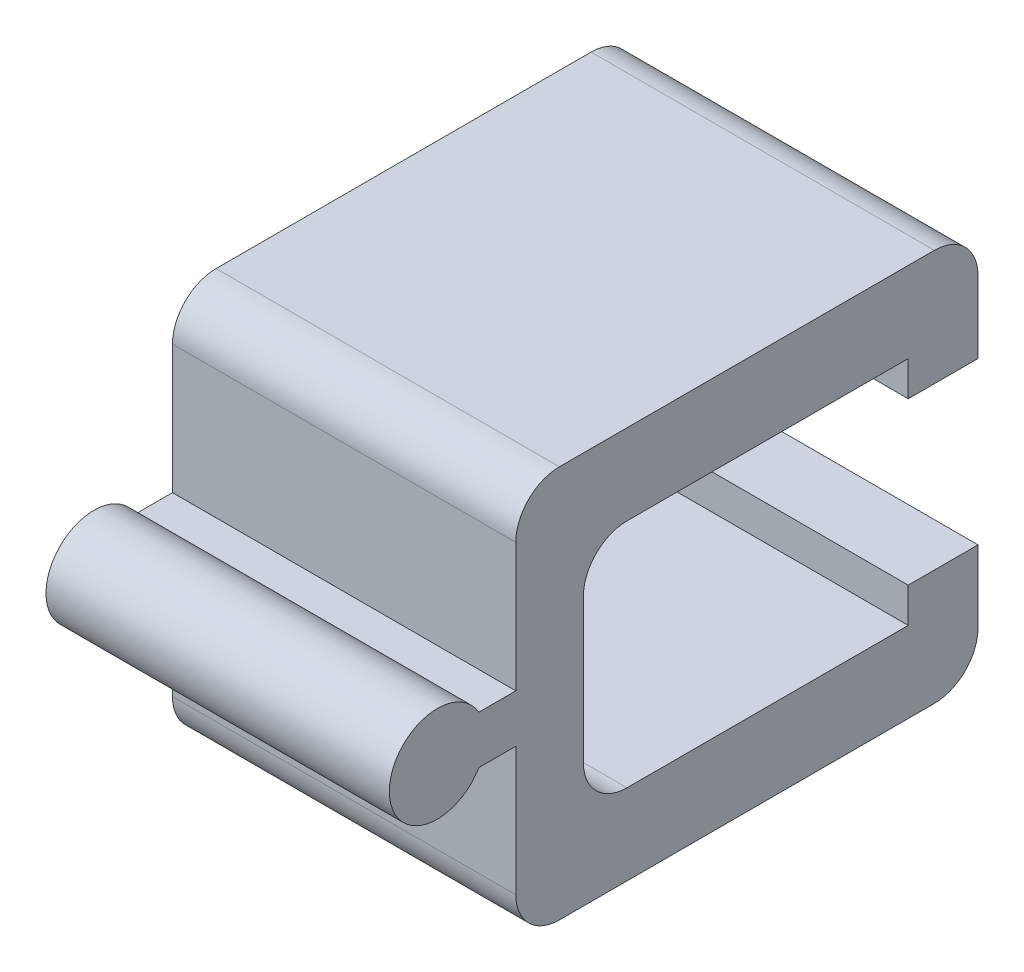
ISO-10303-21;
HEADER;
FILE_DESCRIPTION(('STEP AP214'),'2;1');
FILE_NAME('part.step','',(''),(''),'','','');
FILE_SCHEMA(('AUTOMOTIVE_DESIGN { 1 0 10303 214 1 1 1 1 }'));
ENDSEC;
DATA;
#1=APPLICATION_CONTEXT('core data for automotive mechanical design processes');
#2=APPLICATION_PROTOCOL_DEFINITION('international standard','automotive_design',2000,#1);
#3=PRODUCT_CONTEXT('',#1,'mechanical');
#4=PRODUCT('Part','Part','',(#3));
#5=PRODUCT_RELATED_PRODUCT_CATEGORY('part','',(#4));
#6=PRODUCT_DEFINITION_FORMATION('','',#4);
#7=PRODUCT_DEFINITION_CONTEXT('part definition',#1,'design');
#8=PRODUCT_DEFINITION('design','',#6,#7);
#9=PRODUCT_DEFINITION_SHAPE('','',#8);
#10=(LENGTH_UNIT() NAMED_UNIT(*) SI_UNIT(.MILLI.,.METRE.));
#11=(NAMED_UNIT(*) PLANE_ANGLE_UNIT() SI_UNIT($,.RADIAN.));
#12=(NAMED_UNIT(*) SI_UNIT($,.STERADIAN.) SOLID_ANGLE_UNIT());
#13=UNCERTAINTY_MEASURE_WITH_UNIT(LENGTH_MEASURE(1.E-05),#10,'distance_accuracy_value','');
#14=(GEOMETRIC_REPRESENTATION_CONTEXT(3) GLOBAL_UNCERTAINTY_ASSIGNED_CONTEXT((#13)) GLOBAL_UNIT_ASSIGNED_CONTEXT((#10,
#11,#12)) REPRESENTATION_CONTEXT('',''));
#15=CARTESIAN_POINT('',(0.,0.,0.));
#16=DIRECTION('',(0.,0.,1.));
#17=DIRECTION('',(1.,0.,0.));
#18=AXIS2_PLACEMENT_3D('',#15,#16,#17);
#19=CARTESIAN_POINT('',(5.,0.604217668386227,-93.4562900988192));
#20=DIRECTION('',(0.,0.,-1.));
#21=DIRECTION('',(-1.,0.,0.));
#22=AXIS2_PLACEMENT_3D('',#19,#20,#21);
#23=PLANE('',#22);
#24=DIRECTION('',(0.,-1.,0.));
#25=VECTOR('',#24,1.);
#26=CARTESIAN_POINT('',(-5.,0.604217668386227,-93.4562900988192));
#27=LINE('',#26,#25);
#28=CARTESIAN_POINT('',(-5.,-5.80928233161377,-93.4562900988192));
#29=VERTEX_POINT('',#28);
#30=CARTESIAN_POINT('',(-5.,-9.55578233161377,-93.4562900988192));
#31=VERTEX_POINT('',#30);
#32=EDGE_CURVE('E219',#29,#31,#27,.T.);
#33=ORIENTED_EDGE('',*,*,#32,.T.);
#34=DIRECTION('',(-1.,0.,0.));
#35=VECTOR('',#34,1.);
#36=CARTESIAN_POINT('',(5.,-9.55578233161377,-93.4562900988192));
#37=LINE('',#36,#35);
#38=CARTESIAN_POINT('',(5.,-9.55578233161377,-93.4562900988192));
#39=VERTEX_POINT('',#38);
#40=EDGE_CURVE('E379',#31,#39,#37,.F.);
#41=ORIENTED_EDGE('',*,*,#40,.T.);
#42=DIRECTION('',(0.,-1.,0.));
#43=VECTOR('',#42,1.);
#44=CARTESIAN_POINT('',(5.,0.604217668386227,-93.4562900988192));
#45=LINE('',#44,#43);
#46=CARTESIAN_POINT('',(5.,-5.80928233161377,-93.4562900988192));
#47=VERTEX_POINT('',#46);
#48=EDGE_CURVE('E255',#47,#39,#45,.T.);
#49=ORIENTED_EDGE('',*,*,#48,.F.);
#50=DIRECTION('',(1.,0.,0.));
#51=VECTOR('',#50,1.);
#52=CARTESIAN_POINT('',(-9.62286977969311,-5.80928233161377,-93.4562900988192));
#53=LINE('',#52,#51);
#54=EDGE_CURVE('E239',#29,#47,#53,.T.);
#55=ORIENTED_EDGE('',*,*,#54,.F.);
#56=EDGE_LOOP('',(#33,#41,#49,#55));
#57=FACE_BOUND('',#56,.T.);
#58=ADVANCED_FACE('F42',(#57),#23,.F.);
#59=CARTESIAN_POINT('',(5.,-2.76128233161377,-106.918290098819));
#60=DIRECTION('',(0.,1.,0.));
#61=DIRECTION('',(0.,0.,1.));
#62=AXIS2_PLACEMENT_3D('',#59,#60,#61);
#63=PLANE('',#62);
#64=DIRECTION('',(0.,0.,-1.));
#65=VECTOR('',#64,1.);
#66=CARTESIAN_POINT('',(-5.,-2.76128233161377,-106.918290098819));
#67=LINE('',#66,#65);
#68=CARTESIAN_POINT('',(-5.,-2.76128233161377,-104.886290098819));
#69=VERTEX_POINT('',#68);
#70=CARTESIAN_POINT('',(-5.,-2.76128233161377,-106.918290098819));
#71=VERTEX_POINT('',#70);
#72=EDGE_CURVE('E221',#69,#71,#67,.T.);
#73=ORIENTED_EDGE('',*,*,#72,.T.);
#74=DIRECTION('',(-1.,0.,0.));
#75=VECTOR('',#74,1.);
#76=CARTESIAN_POINT('',(5.,-2.76128233161377,-106.918290098819));
#77=LINE('',#76,#75);
#78=CARTESIAN_POINT('',(5.,-2.76128233161377,-106.918290098819));
#79=VERTEX_POINT('',#78);
#80=EDGE_CURVE('E340',#79,#71,#77,.T.);
#81=ORIENTED_EDGE('',*,*,#80,.F.);
#82=DIRECTION('',(0.,0.,-1.));
#83=VECTOR('',#82,1.);
#84=CARTESIAN_POINT('',(5.,-2.76128233161377,-106.918290098819));
#85=LINE('',#84,#83);
#86=CARTESIAN_POINT('',(5.,-2.76128233161377,-104.886290098819));
#87=VERTEX_POINT('',#86);
#88=EDGE_CURVE('E242',#87,#79,#85,.T.);
#89=ORIENTED_EDGE('',*,*,#88,.F.);
#90=DIRECTION('',(-1.,0.,0.));
#91=VECTOR('',#90,1.);
#92=CARTESIAN_POINT('',(5.,-2.76128233161377,-104.886290098819));
#93=LINE('',#92,#91);
#94=EDGE_CURVE('E284',#87,#69,#93,.T.);
#95=ORIENTED_EDGE('',*,*,#94,.T.);
#96=EDGE_LOOP('',(#73,#81,#89,#95));
#97=FACE_BOUND('',#96,.T.);
#98=ADVANCED_FACE('F435',(#97),#63,.F.);
#99=CARTESIAN_POINT('',(5.,0.604217668386227,-106.918290098819));
#100=DIRECTION('',(0.,0.,1.));
#101=DIRECTION('',(1.,0.,0.));
#102=AXIS2_PLACEMENT_3D('',#99,#100,#101);
#103=PLANE('',#102);
#104=DIRECTION('',(0.,1.,0.));
#105=VECTOR('',#104,1.);
#106=CARTESIAN_POINT('',(-5.,0.604217668386227,-106.918290098819));
#107=LINE('',#106,#105);
#108=CARTESIAN_POINT('',(-5.,-0.665782331613773,-106.918290098819));
#109=VERTEX_POINT('',#108);
#110=EDGE_CURVE('E227',#71,#109,#107,.T.);
#111=ORIENTED_EDGE('',*,*,#110,.T.);
#112=DIRECTION('',(-1.,0.,0.));
#113=VECTOR('',#112,1.);
#114=CARTESIAN_POINT('',(5.,-0.665782331613773,-106.918290098819));
#115=LINE('',#114,#113);
#116=CARTESIAN_POINT('',(5.,-0.665782331613773,-106.918290098819));
#117=VERTEX_POINT('',#116);
#118=EDGE_CURVE('E406',#109,#117,#115,.F.);
#119=ORIENTED_EDGE('',*,*,#118,.T.);
#120=DIRECTION('',(0.,1.,0.));
#121=VECTOR('',#120,1.);
#122=CARTESIAN_POINT('',(5.,0.604217668386227,-106.918290098819));
#123=LINE('',#122,#121);
#124=EDGE_CURVE('E246',#79,#117,#123,.T.);
#125=ORIENTED_EDGE('',*,*,#124,.F.);
#126=ORIENTED_EDGE('',*,*,#80,.T.);
#127=EDGE_LOOP('',(#111,#119,#125,#126));
#128=FACE_BOUND('',#127,.T.);
#129=ADVANCED_FACE('F437',(#128),#103,.F.);
#130=CARTESIAN_POINT('',(5.,0.604217668386227,-106.918290098819));
#131=DIRECTION('',(0.,-1.,0.));
#132=DIRECTION('',(0.,0.,-1.));
#133=AXIS2_PLACEMENT_3D('',#130,#131,#132);
#134=PLANE('',#133);
#135=DIRECTION('',(0.,0.,1.));
#136=VECTOR('',#135,1.);
#137=CARTESIAN_POINT('',(-5.,0.604217668386227,-106.918290098819));
#138=LINE('',#137,#136);
#139=CARTESIAN_POINT('',(-5.,0.604217668386227,-105.648290098819));
#140=VERTEX_POINT('',#139);
#141=CARTESIAN_POINT('',(-5.,0.604217668386227,-94.7262900988192));
#142=VERTEX_POINT('',#141);
#143=EDGE_CURVE('E289',#140,#142,#138,.T.);
#144=ORIENTED_EDGE('',*,*,#143,.T.);
#145=DIRECTION('',(-1.,0.,0.));
#146=VECTOR('',#145,1.);
#147=CARTESIAN_POINT('',(5.,0.604217668386227,-94.7262900988192));
#148=LINE('',#147,#146);
#149=CARTESIAN_POINT('',(5.,0.604217668386227,-94.7262900988192));
#150=VERTEX_POINT('',#149);
#151=EDGE_CURVE('E403',#142,#150,#148,.F.);
#152=ORIENTED_EDGE('',*,*,#151,.T.);
#153=DIRECTION('',(0.,0.,1.));
#154=VECTOR('',#153,1.);
#155=CARTESIAN_POINT('',(5.,0.604217668386227,-106.918290098819));
#156=LINE('',#155,#154);
#157=CARTESIAN_POINT('',(5.,0.604217668386227,-105.648290098819));
#158=VERTEX_POINT('',#157);
#159=EDGE_CURVE('E251',#158,#150,#156,.T.);
#160=ORIENTED_EDGE('',*,*,#159,.F.);
#161=DIRECTION('',(-1.,0.,0.));
#162=VECTOR('',#161,1.);
#163=CARTESIAN_POINT('',(5.,0.604217668386227,-105.648290098819));
#164=LINE('',#163,#162);
#165=EDGE_CURVE('E399',#158,#140,#164,.T.);
#166=ORIENTED_EDGE('',*,*,#165,.T.);
#167=EDGE_LOOP('',(#144,#152,#160,#166));
#168=FACE_BOUND('',#167,.T.);
#169=ADVANCED_FACE('F445',(#168),#134,.F.);
#170=CARTESIAN_POINT('',(5.,-0.665782331613773,-93.4562900988192));
#171=VERTEX_POINT('',#170);
#172=CARTESIAN_POINT('',(5.,-4.41228233161377,-93.4562900988192));
#173=VERTEX_POINT('',#172);
#174=EDGE_CURVE('E256',#171,#173,#45,.T.);
#175=ORIENTED_EDGE('',*,*,#174,.F.);
#176=DIRECTION('',(-1.,0.,0.));
#177=VECTOR('',#176,1.);
#178=CARTESIAN_POINT('',(5.,-0.665782331613773,-93.4562900988192));
#179=LINE('',#178,#177);
#180=CARTESIAN_POINT('',(-5.,-0.665782331613773,-93.4562900988192));
#181=VERTEX_POINT('',#180);
#182=EDGE_CURVE('E395',#171,#181,#179,.T.);
#183=ORIENTED_EDGE('',*,*,#182,.T.);
#184=CARTESIAN_POINT('',(-5.,-4.41228233161377,-93.4562900988192));
#185=VERTEX_POINT('',#184);
#186=EDGE_CURVE('E293',#181,#185,#27,.T.);
#187=ORIENTED_EDGE('',*,*,#186,.T.);
#188=DIRECTION('',(1.,0.,0.));
#189=VECTOR('',#188,1.);
#190=CARTESIAN_POINT('',(-9.62286977969311,-4.41228233161377,-93.4562900988192));
#191=LINE('',#190,#189);
#192=EDGE_CURVE('E235',#185,#173,#191,.T.);
#193=ORIENTED_EDGE('',*,*,#192,.T.);
#194=EDGE_LOOP('',(#175,#183,#187,#193));
#195=FACE_BOUND('',#194,.T.);
#196=ADVANCED_FACE('F454',(#195),#23,.F.);
#197=CARTESIAN_POINT('',(5.,-10.8257823316138,-106.918290098819));
#198=DIRECTION('',(0.,1.,0.));
#199=DIRECTION('',(0.,0.,1.));
#200=AXIS2_PLACEMENT_3D('',#197,#198,#199);
#201=PLANE('',#200);
#202=DIRECTION('',(0.,0.,-1.));
#203=VECTOR('',#202,1.);
#204=CARTESIAN_POINT('',(-5.,-10.8257823316138,-106.918290098819));
#205=LINE('',#204,#203);
#206=CARTESIAN_POINT('',(-5.,-10.8257823316138,-94.7262900988192));
#207=VERTEX_POINT('',#206);
#208=CARTESIAN_POINT('',(-5.,-10.8257823316138,-105.648290098819));
#209=VERTEX_POINT('',#208);
#210=EDGE_CURVE('E296',#207,#209,#205,.T.);
#211=ORIENTED_EDGE('',*,*,#210,.T.);
#212=DIRECTION('',(-1.,0.,0.));
#213=VECTOR('',#212,1.);
#214=CARTESIAN_POINT('',(5.,-10.8257823316138,-105.648290098819));
#215=LINE('',#214,#213);
#216=CARTESIAN_POINT('',(5.,-10.8257823316138,-105.648290098819));
#217=VERTEX_POINT('',#216);
#218=EDGE_CURVE('E364',#209,#217,#215,.F.);
#219=ORIENTED_EDGE('',*,*,#218,.T.);
#220=DIRECTION('',(0.,0.,-1.));
#221=VECTOR('',#220,1.);
#222=CARTESIAN_POINT('',(5.,-10.8257823316138,-106.918290098819));
#223=LINE('',#222,#221);
#224=CARTESIAN_POINT('',(5.,-10.8257823316138,-94.7262900988192));
#225=VERTEX_POINT('',#224);
#226=EDGE_CURVE('E259',#225,#217,#223,.T.);
#227=ORIENTED_EDGE('',*,*,#226,.F.);
#228=DIRECTION('',(-1.,0.,0.));
#229=VECTOR('',#228,1.);
#230=CARTESIAN_POINT('',(5.,-10.8257823316138,-94.7262900988192));
#231=LINE('',#230,#229);
#232=EDGE_CURVE('E360',#225,#207,#231,.T.);
#233=ORIENTED_EDGE('',*,*,#232,.T.);
#234=EDGE_LOOP('',(#211,#219,#227,#233));
#235=FACE_BOUND('',#234,.T.);
#236=ADVANCED_FACE('F486',(#235),#201,.F.);
#237=CARTESIAN_POINT('',(5.,-7.46028233161377,-106.918290098819));
#238=DIRECTION('',(0.,0.,1.));
#239=DIRECTION('',(1.,0.,0.));
#240=AXIS2_PLACEMENT_3D('',#237,#238,#239);
#241=PLANE('',#240);
#242=DIRECTION('',(0.,1.,0.));
#243=VECTOR('',#242,1.);
#244=CARTESIAN_POINT('',(5.,-7.46028233161377,-106.918290098819));
#245=LINE('',#244,#243);
#246=CARTESIAN_POINT('',(5.,-9.55578233161377,-106.918290098819));
#247=VERTEX_POINT('',#246);
#248=CARTESIAN_POINT('',(5.,-7.46028233161377,-106.918290098819));
#249=VERTEX_POINT('',#248);
#250=EDGE_CURVE('E263',#247,#249,#245,.T.);
#251=ORIENTED_EDGE('',*,*,#250,.F.);
#252=DIRECTION('',(-1.,0.,0.));
#253=VECTOR('',#252,1.);
#254=CARTESIAN_POINT('',(5.,-9.55578233161377,-106.918290098819));
#255=LINE('',#254,#253);
#256=CARTESIAN_POINT('',(-5.,-9.55578233161377,-106.918290098819));
#257=VERTEX_POINT('',#256);
#258=EDGE_CURVE('E344',#247,#257,#255,.T.);
#259=ORIENTED_EDGE('',*,*,#258,.T.);
#260=DIRECTION('',(0.,1.,0.));
#261=VECTOR('',#260,1.);
#262=CARTESIAN_POINT('',(-5.,-7.46028233161377,-106.918290098819));
#263=LINE('',#262,#261);
#264=CARTESIAN_POINT('',(-5.,-7.46028233161377,-106.918290098819));
#265=VERTEX_POINT('',#264);
#266=EDGE_CURVE('E300',#257,#265,#263,.T.);
#267=ORIENTED_EDGE('',*,*,#266,.T.);
#268=DIRECTION('',(-1.,0.,0.));
#269=VECTOR('',#268,1.);
#270=CARTESIAN_POINT('',(5.,-7.46028233161377,-106.918290098819));
#271=LINE('',#270,#269);
#272=EDGE_CURVE('E336',#249,#265,#271,.T.);
#273=ORIENTED_EDGE('',*,*,#272,.F.);
#274=EDGE_LOOP('',(#251,#259,#267,#273));
#275=FACE_BOUND('',#274,.T.);
#276=ADVANCED_FACE('F491',(#275),#241,.F.);
#277=CARTESIAN_POINT('',(5.,-7.46028233161377,-106.918290098819));
#278=DIRECTION('',(0.,-1.,0.));
#279=DIRECTION('',(0.,0.,-1.));
#280=AXIS2_PLACEMENT_3D('',#277,#278,#279);
#281=PLANE('',#280);
#282=DIRECTION('',(0.,0.,1.));
#283=VECTOR('',#282,1.);
#284=CARTESIAN_POINT('',(-5.,-7.46028233161377,-106.918290098819));
#285=LINE('',#284,#283);
#286=CARTESIAN_POINT('',(-5.,-7.46028233161377,-104.886290098819));
#287=VERTEX_POINT('',#286);
#288=EDGE_CURVE('E303',#265,#287,#285,.T.);
#289=ORIENTED_EDGE('',*,*,#288,.T.);
#290=DIRECTION('',(-1.,0.,0.));
#291=VECTOR('',#290,1.);
#292=CARTESIAN_POINT('',(5.,-7.46028233161377,-104.886290098819));
#293=LINE('',#292,#291);
#294=CARTESIAN_POINT('',(5.,-7.46028233161377,-104.886290098819));
#295=VERTEX_POINT('',#294);
#296=EDGE_CURVE('E332',#295,#287,#293,.T.);
#297=ORIENTED_EDGE('',*,*,#296,.F.);
#298=DIRECTION('',(0.,0.,1.));
#299=VECTOR('',#298,1.);
#300=CARTESIAN_POINT('',(5.,-7.46028233161377,-106.918290098819));
#301=LINE('',#300,#299);
#302=EDGE_CURVE('E266',#249,#295,#301,.T.);
#303=ORIENTED_EDGE('',*,*,#302,.F.);
#304=ORIENTED_EDGE('',*,*,#272,.T.);
#305=EDGE_LOOP('',(#289,#297,#303,#304));
#306=FACE_BOUND('',#305,.T.);
#307=ADVANCED_FACE('F603',(#306),#281,.F.);
#308=CARTESIAN_POINT('',(5.,-7.46028233161377,-104.886290098819));
#309=DIRECTION('',(0.,0.,-1.));
#310=DIRECTION('',(-1.,0.,0.));
#311=AXIS2_PLACEMENT_3D('',#308,#309,#310);
#312=PLANE('',#311);
#313=DIRECTION('',(0.,-1.,0.));
#314=VECTOR('',#313,1.);
#315=CARTESIAN_POINT('',(-5.,-7.46028233161377,-104.886290098819));
#316=LINE('',#315,#314);
#317=CARTESIAN_POINT('',(-5.,-8.47628233161377,-104.886290098819));
#318=VERTEX_POINT('',#317);
#319=EDGE_CURVE('E306',#287,#318,#316,.T.);
#320=ORIENTED_EDGE('',*,*,#319,.T.);
#321=DIRECTION('',(-1.,0.,0.));
#322=VECTOR('',#321,1.);
#323=CARTESIAN_POINT('',(5.,-8.47628233161377,-104.886290098819));
#324=LINE('',#323,#322);
#325=CARTESIAN_POINT('',(5.,-8.47628233161377,-104.886290098819));
#326=VERTEX_POINT('',#325);
#327=EDGE_CURVE('E328',#326,#318,#324,.T.);
#328=ORIENTED_EDGE('',*,*,#327,.F.);
#329=DIRECTION('',(0.,-1.,0.));
#330=VECTOR('',#329,1.);
#331=CARTESIAN_POINT('',(5.,-7.46028233161377,-104.886290098819));
#332=LINE('',#331,#330);
#333=EDGE_CURVE('E269',#295,#326,#332,.T.);
#334=ORIENTED_EDGE('',*,*,#333,.F.);
#335=ORIENTED_EDGE('',*,*,#296,.T.);
#336=EDGE_LOOP('',(#320,#328,#334,#335));
#337=FACE_BOUND('',#336,.T.);
#338=ADVANCED_FACE('F591',(#337),#312,.F.);
#339=CARTESIAN_POINT('',(5.,-8.47628233161377,-104.886290098819));
#340=DIRECTION('',(0.,-1.,0.));
#341=DIRECTION('',(0.,0.,-1.));
#342=AXIS2_PLACEMENT_3D('',#339,#340,#341);
#343=PLANE('',#342);
#344=DIRECTION('',(0.,0.,1.));
#345=VECTOR('',#344,1.);
#346=CARTESIAN_POINT('',(-5.,-8.47628233161377,-104.886290098819));
#347=LINE('',#346,#345);
#348=CARTESIAN_POINT('',(-5.,-8.47628233161377,-96.6947900988192));
#349=VERTEX_POINT('',#348);
#350=EDGE_CURVE('E309',#318,#349,#347,.T.);
#351=ORIENTED_EDGE('',*,*,#350,.T.);
#352=DIRECTION('',(-1.,0.,0.));
#353=VECTOR('',#352,1.);
#354=CARTESIAN_POINT('',(5.,-8.47628233161377,-96.6947900988192));
#355=LINE('',#354,#353);
#356=CARTESIAN_POINT('',(5.,-8.47628233161377,-96.6947900988192));
#357=VERTEX_POINT('',#356);
#358=EDGE_CURVE('E388',#349,#357,#355,.F.);
#359=ORIENTED_EDGE('',*,*,#358,.T.);
#360=DIRECTION('',(0.,0.,1.));
#361=VECTOR('',#360,1.);
#362=CARTESIAN_POINT('',(5.,-8.47628233161377,-104.886290098819));
#363=LINE('',#362,#361);
#364=EDGE_CURVE('E272',#326,#357,#363,.T.);
#365=ORIENTED_EDGE('',*,*,#364,.F.);
#366=ORIENTED_EDGE('',*,*,#327,.T.);
#367=EDGE_LOOP('',(#351,#359,#365,#366));
#368=FACE_BOUND('',#367,.T.);
#369=ADVANCED_FACE('F582',(#368),#343,.F.);
#370=CARTESIAN_POINT('',(5.,-1.74528233161377,-95.4247900988192));
#371=DIRECTION('',(0.,0.,1.));
#372=DIRECTION('',(1.,0.,0.));
#373=AXIS2_PLACEMENT_3D('',#370,#371,#372);
#374=PLANE('',#373);
#375=DIRECTION('',(0.,1.,0.));
#376=VECTOR('',#375,1.);
#377=CARTESIAN_POINT('',(5.,-1.74528233161377,-95.4247900988192));
#378=LINE('',#377,#376);
#379=CARTESIAN_POINT('',(5.,-7.20628233161377,-95.4247900988192));
#380=VERTEX_POINT('',#379);
#381=CARTESIAN_POINT('',(5.,-3.01528233161377,-95.4247900988192));
#382=VERTEX_POINT('',#381);
#383=EDGE_CURVE('E276',#380,#382,#378,.T.);
#384=ORIENTED_EDGE('',*,*,#383,.F.);
#385=DIRECTION('',(-1.,0.,0.));
#386=VECTOR('',#385,1.);
#387=CARTESIAN_POINT('',(-5.,-7.20628233161377,-95.4247900988192));
#388=LINE('',#387,#386);
#389=CARTESIAN_POINT('',(-5.,-7.20628233161377,-95.4247900988192));
#390=VERTEX_POINT('',#389);
#391=EDGE_CURVE('E384',#380,#390,#388,.T.);
#392=ORIENTED_EDGE('',*,*,#391,.T.);
#393=DIRECTION('',(0.,1.,0.));
#394=VECTOR('',#393,1.);
#395=CARTESIAN_POINT('',(-5.,-1.74528233161377,-95.4247900988192));
#396=LINE('',#395,#394);
#397=CARTESIAN_POINT('',(-5.,-3.01528233161377,-95.4247900988192));
#398=VERTEX_POINT('',#397);
#399=EDGE_CURVE('E313',#390,#398,#396,.T.);
#400=ORIENTED_EDGE('',*,*,#399,.T.);
#401=DIRECTION('',(-1.,0.,0.));
#402=VECTOR('',#401,1.);
#403=CARTESIAN_POINT('',(5.,-3.01528233161377,-95.4247900988192));
#404=LINE('',#403,#402);
#405=EDGE_CURVE('E64',#398,#382,#404,.F.);
#406=ORIENTED_EDGE('',*,*,#405,.T.);
#407=EDGE_LOOP('',(#384,#392,#400,#406));
#408=FACE_BOUND('',#407,.T.);
#409=ADVANCED_FACE('F420',(#408),#374,.F.);
#410=CARTESIAN_POINT('',(5.,-1.74528233161377,-104.886290098819));
#411=DIRECTION('',(0.,1.,0.));
#412=DIRECTION('',(0.,0.,1.));
#413=AXIS2_PLACEMENT_3D('',#410,#411,#412);
#414=PLANE('',#413);
#415=DIRECTION('',(0.,0.,-1.));
#416=VECTOR('',#415,1.);
#417=CARTESIAN_POINT('',(5.,-1.74528233161377,-104.886290098819));
#418=LINE('',#417,#416);
#419=CARTESIAN_POINT('',(5.,-1.74528233161377,-96.6947900988192));
#420=VERTEX_POINT('',#419);
#421=CARTESIAN_POINT('',(5.,-1.74528233161377,-104.886290098819));
#422=VERTEX_POINT('',#421);
#423=EDGE_CURVE('E279',#420,#422,#418,.T.);
#424=ORIENTED_EDGE('',*,*,#423,.F.);
#425=DIRECTION('',(-1.,0.,0.));
#426=VECTOR('',#425,1.);
#427=CARTESIAN_POINT('',(-5.,-1.74528233161377,-96.6947900988192));
#428=LINE('',#427,#426);
#429=CARTESIAN_POINT('',(-5.,-1.74528233161377,-96.6947900988192));
#430=VERTEX_POINT('',#429);
#431=EDGE_CURVE('E391',#420,#430,#428,.T.);
#432=ORIENTED_EDGE('',*,*,#431,.T.);
#433=DIRECTION('',(0.,0.,-1.));
#434=VECTOR('',#433,1.);
#435=CARTESIAN_POINT('',(-5.,-1.74528233161377,-104.886290098819));
#436=LINE('',#435,#434);
#437=CARTESIAN_POINT('',(-5.,-1.74528233161377,-104.886290098819));
#438=VERTEX_POINT('',#437);
#439=EDGE_CURVE('E316',#430,#438,#436,.T.);
#440=ORIENTED_EDGE('',*,*,#439,.T.);
#441=DIRECTION('',(-1.,0.,0.));
#442=VECTOR('',#441,1.);
#443=CARTESIAN_POINT('',(5.,-1.74528233161377,-104.886290098819));
#444=LINE('',#443,#442);
#445=EDGE_CURVE('E324',#422,#438,#444,.T.);
#446=ORIENTED_EDGE('',*,*,#445,.F.);
#447=EDGE_LOOP('',(#424,#432,#440,#446));
#448=FACE_BOUND('',#447,.T.);
#449=ADVANCED_FACE('F424',(#448),#414,.F.);
#450=CARTESIAN_POINT('',(5.,-2.76128233161377,-104.886290098819));
#451=DIRECTION('',(0.,0.,-1.));
#452=DIRECTION('',(-1.,0.,0.));
#453=AXIS2_PLACEMENT_3D('',#450,#451,#452);
#454=PLANE('',#453);
#455=DIRECTION('',(0.,-1.,0.));
#456=VECTOR('',#455,1.);
#457=CARTESIAN_POINT('',(-5.,-2.76128233161377,-104.886290098819));
#458=LINE('',#457,#456);
#459=EDGE_CURVE('E247',#438,#69,#458,.T.);
#460=ORIENTED_EDGE('',*,*,#459,.T.);
#461=ORIENTED_EDGE('',*,*,#94,.F.);
#462=DIRECTION('',(0.,-1.,0.));
#463=VECTOR('',#462,1.);
#464=CARTESIAN_POINT('',(5.,-2.76128233161377,-104.886290098819));
#465=LINE('',#464,#463);
#466=EDGE_CURVE('E282',#422,#87,#465,.T.);
#467=ORIENTED_EDGE('',*,*,#466,.F.);
#468=ORIENTED_EDGE('',*,*,#445,.T.);
#469=EDGE_LOOP('',(#460,#461,#467,#468));
#470=FACE_BOUND('',#469,.T.);
#471=ADVANCED_FACE('F432',(#470),#454,.F.);
#472=CARTESIAN_POINT('',(5.,0.,0.));
#473=DIRECTION('',(-1.,0.,0.));
#474=DIRECTION('',(0.,0.,1.));
#475=AXIS2_PLACEMENT_3D('',#472,#473,#474);
#476=PLANE('',#475);
#477=ORIENTED_EDGE('',*,*,#226,.T.);
#478=CARTESIAN_POINT('',(5.,-9.55578233161377,-105.648290098819));
#479=DIRECTION('',(-1.,0.,0.));
#480=DIRECTION('',(0.,0.,1.));
#481=AXIS2_PLACEMENT_3D('',#478,#479,#480);
#482=CIRCLE('',#481,1.27);
#483=EDGE_CURVE('E376',#217,#247,#482,.F.);
#484=ORIENTED_EDGE('',*,*,#483,.T.);
#485=ORIENTED_EDGE('',*,*,#250,.T.);
#486=ORIENTED_EDGE('',*,*,#302,.T.);
#487=ORIENTED_EDGE('',*,*,#333,.T.);
#488=ORIENTED_EDGE('',*,*,#364,.T.);
#489=CARTESIAN_POINT('',(5.,-7.20628233161377,-96.6947900988192));
#490=DIRECTION('',(-1.,0.,0.));
#491=DIRECTION('',(0.,0.,1.));
#492=AXIS2_PLACEMENT_3D('',#489,#490,#491);
#493=CIRCLE('',#492,1.27);
#494=EDGE_CURVE('E412',#357,#380,#493,.T.);
#495=ORIENTED_EDGE('',*,*,#494,.T.);
#496=ORIENTED_EDGE('',*,*,#383,.T.);
#497=CARTESIAN_POINT('',(5.,-3.01528233161377,-96.6947900988192));
#498=DIRECTION('',(-1.,0.,0.));
#499=DIRECTION('',(0.,0.,1.));
#500=AXIS2_PLACEMENT_3D('',#497,#498,#499);
#501=CIRCLE('',#500,1.27);
#502=EDGE_CURVE('E11',#382,#420,#501,.T.);
#503=ORIENTED_EDGE('',*,*,#502,.T.);
#504=ORIENTED_EDGE('',*,*,#423,.T.);
#505=ORIENTED_EDGE('',*,*,#466,.T.);
#506=ORIENTED_EDGE('',*,*,#88,.T.);
#507=ORIENTED_EDGE('',*,*,#124,.T.);
#508=CARTESIAN_POINT('',(5.,-0.665782331613773,-105.648290098819));
#509=DIRECTION('',(-1.,0.,0.));
#510=DIRECTION('',(0.,0.,1.));
#511=AXIS2_PLACEMENT_3D('',#508,#509,#510);
#512=CIRCLE('',#511,1.27);
#513=EDGE_CURVE('E367',#117,#158,#512,.F.);
#514=ORIENTED_EDGE('',*,*,#513,.T.);
#515=ORIENTED_EDGE('',*,*,#159,.T.);
#516=CARTESIAN_POINT('',(5.,-0.665782331613773,-94.7262900988192));
#517=DIRECTION('',(-1.,0.,0.));
#518=DIRECTION('',(0.,0.,1.));
#519=AXIS2_PLACEMENT_3D('',#516,#517,#518);
#520=CIRCLE('',#519,1.27);
#521=EDGE_CURVE('E370',#150,#171,#520,.F.);
#522=ORIENTED_EDGE('',*,*,#521,.T.);
#523=ORIENTED_EDGE('',*,*,#174,.T.);
#524=DIRECTION('',(0.,0.,1.));
#525=VECTOR('',#524,1.);
#526=CARTESIAN_POINT('',(5.,-4.41228233161377,0.));
#527=LINE('',#526,#525);
#528=CARTESIAN_POINT('',(5.,-4.41228233161377,-92.380127587906));
#529=VERTEX_POINT('',#528);
#530=EDGE_CURVE('E229',#173,#529,#527,.T.);
#531=ORIENTED_EDGE('',*,*,#530,.T.);
#532=CARTESIAN_POINT('',(5.,-5.11078233161377,-91.1702900988192));
#533=DIRECTION('',(1.,0.,0.));
#534=DIRECTION('',(0.,0.,-1.));
#535=AXIS2_PLACEMENT_3D('',#532,#533,#534);
#536=CIRCLE('',#535,1.39699999999999);
#537=CARTESIAN_POINT('',(5.,-5.80928233161377,-92.380127587906));
#538=VERTEX_POINT('',#537);
#539=EDGE_CURVE('E222',#529,#538,#536,.T.);
#540=ORIENTED_EDGE('',*,*,#539,.T.);
#541=DIRECTION('',(0.,0.,1.));
#542=VECTOR('',#541,1.);
#543=CARTESIAN_POINT('',(5.,-5.80928233161381,0.));
#544=LINE('',#543,#542);
#545=EDGE_CURVE('E203',#47,#538,#544,.T.);
#546=ORIENTED_EDGE('',*,*,#545,.F.);
#547=ORIENTED_EDGE('',*,*,#48,.T.);
#548=CARTESIAN_POINT('',(5.,-9.55578233161377,-94.7262900988192));
#549=DIRECTION('',(-1.,0.,0.));
#550=DIRECTION('',(0.,0.,1.));
#551=AXIS2_PLACEMENT_3D('',#548,#549,#550);
#552=CIRCLE('',#551,1.27);
#553=EDGE_CURVE('E373',#39,#225,#552,.F.);
#554=ORIENTED_EDGE('',*,*,#553,.T.);
#555=EDGE_LOOP('',(#477,#484,#485,#486,#487,#488,#495,#496,#503,#504,#505,#506,#507,#514,#515,
#522,#523,#531,#540,#546,#547,#554));
#556=FACE_BOUND('',#555,.T.);
#557=ADVANCED_FACE('F427',(#556),#476,.F.);
#558=CARTESIAN_POINT('',(-5.,0.,0.));
#559=DIRECTION('',(-1.,0.,0.));
#560=DIRECTION('',(0.,0.,1.));
#561=AXIS2_PLACEMENT_3D('',#558,#559,#560);
#562=PLANE('',#561);
#563=ORIENTED_EDGE('',*,*,#266,.F.);
#564=CARTESIAN_POINT('',(-5.,-9.55578233161377,-105.648290098819));
#565=DIRECTION('',(-1.,0.,0.));
#566=DIRECTION('',(0.,0.,1.));
#567=AXIS2_PLACEMENT_3D('',#564,#565,#566);
#568=CIRCLE('',#567,1.27);
#569=EDGE_CURVE('E357',#257,#209,#568,.T.);
#570=ORIENTED_EDGE('',*,*,#569,.T.);
#571=ORIENTED_EDGE('',*,*,#210,.F.);
#572=CARTESIAN_POINT('',(-5.,-9.55578233161377,-94.7262900988192));
#573=DIRECTION('',(-1.,0.,0.));
#574=DIRECTION('',(0.,0.,1.));
#575=AXIS2_PLACEMENT_3D('',#572,#573,#574);
#576=CIRCLE('',#575,1.27);
#577=EDGE_CURVE('E354',#207,#31,#576,.T.);
#578=ORIENTED_EDGE('',*,*,#577,.T.);
#579=ORIENTED_EDGE('',*,*,#32,.F.);
#580=DIRECTION('',(0.,0.,1.));
#581=VECTOR('',#580,1.);
#582=CARTESIAN_POINT('',(-5.,-5.80928233161381,0.));
#583=LINE('',#582,#581);
#584=CARTESIAN_POINT('',(-5.,-5.80928233161377,-92.380127587906));
#585=VERTEX_POINT('',#584);
#586=EDGE_CURVE('E209',#29,#585,#583,.T.);
#587=ORIENTED_EDGE('',*,*,#586,.T.);
#588=CARTESIAN_POINT('',(-5.,-5.11078233161377,-91.1702900988192));
#589=DIRECTION('',(-1.,0.,0.));
#590=DIRECTION('',(0.,0.,1.));
#591=AXIS2_PLACEMENT_3D('',#588,#589,#590);
#592=CIRCLE('',#591,1.39699999999999);
#593=CARTESIAN_POINT('',(-5.,-4.41228233161377,-92.380127587906));
#594=VERTEX_POINT('',#593);
#595=EDGE_CURVE('E192',#594,#585,#592,.F.);
#596=ORIENTED_EDGE('',*,*,#595,.F.);
#597=DIRECTION('',(0.,0.,1.));
#598=VECTOR('',#597,1.);
#599=CARTESIAN_POINT('',(-5.,-4.41228233161377,0.));
#600=LINE('',#599,#598);
#601=EDGE_CURVE('E213',#185,#594,#600,.T.);
#602=ORIENTED_EDGE('',*,*,#601,.F.);
#603=ORIENTED_EDGE('',*,*,#186,.F.);
#604=CARTESIAN_POINT('',(-5.,-0.665782331613773,-94.7262900988192));
#605=DIRECTION('',(-1.,0.,0.));
#606=DIRECTION('',(0.,0.,1.));
#607=AXIS2_PLACEMENT_3D('',#604,#605,#606);
#608=CIRCLE('',#607,1.27);
#609=EDGE_CURVE('E351',#181,#142,#608,.T.);
#610=ORIENTED_EDGE('',*,*,#609,.T.);
#611=ORIENTED_EDGE('',*,*,#143,.F.);
#612=CARTESIAN_POINT('',(-5.,-0.665782331613773,-105.648290098819));
#613=DIRECTION('',(-1.,0.,0.));
#614=DIRECTION('',(0.,0.,1.));
#615=AXIS2_PLACEMENT_3D('',#612,#613,#614);
#616=CIRCLE('',#615,1.27);
#617=EDGE_CURVE('E348',#140,#109,#616,.T.);
#618=ORIENTED_EDGE('',*,*,#617,.T.);
#619=ORIENTED_EDGE('',*,*,#110,.F.);
#620=ORIENTED_EDGE('',*,*,#72,.F.);
#621=ORIENTED_EDGE('',*,*,#459,.F.);
#622=ORIENTED_EDGE('',*,*,#439,.F.);
#623=CARTESIAN_POINT('',(-5.,-3.01528233161377,-96.6947900988192));
#624=DIRECTION('',(-1.,0.,0.));
#625=DIRECTION('',(0.,0.,1.));
#626=AXIS2_PLACEMENT_3D('',#623,#624,#625);
#627=CIRCLE('',#626,1.27);
#628=EDGE_CURVE('E51',#430,#398,#627,.F.);
#629=ORIENTED_EDGE('',*,*,#628,.T.);
#630=ORIENTED_EDGE('',*,*,#399,.F.);
#631=CARTESIAN_POINT('',(-5.,-7.20628233161377,-96.6947900988192));
#632=DIRECTION('',(-1.,0.,0.));
#633=DIRECTION('',(0.,0.,1.));
#634=AXIS2_PLACEMENT_3D('',#631,#632,#633);
#635=CIRCLE('',#634,1.27);
#636=EDGE_CURVE('E409',#390,#349,#635,.F.);
#637=ORIENTED_EDGE('',*,*,#636,.T.);
#638=ORIENTED_EDGE('',*,*,#350,.F.);
#639=ORIENTED_EDGE('',*,*,#319,.F.);
#640=ORIENTED_EDGE('',*,*,#288,.F.);
#641=EDGE_LOOP('',(#563,#570,#571,#578,#579,#587,#596,#602,#603,#610,#611,#618,#619,#620,#621,
#622,#629,#630,#637,#638,#639,#640));
#642=FACE_BOUND('',#641,.T.);
#643=ADVANCED_FACE('F217',(#642),#562,.T.);
#644=CARTESIAN_POINT('',(-9.62286977969311,-5.80928233161381,0.));
#645=DIRECTION('',(0.,1.,0.));
#646=DIRECTION('',(0.,0.,1.));
#647=AXIS2_PLACEMENT_3D('',#644,#645,#646);
#648=PLANE('',#647);
#649=ORIENTED_EDGE('',*,*,#586,.F.);
#650=ORIENTED_EDGE('',*,*,#54,.T.);
#651=ORIENTED_EDGE('',*,*,#545,.T.);
#652=DIRECTION('',(1.,0.,0.));
#653=VECTOR('',#652,1.);
#654=CARTESIAN_POINT('',(-9.62286977969311,-5.80928233161377,-92.380127587906));
#655=LINE('',#654,#653);
#656=EDGE_CURVE('E196',#585,#538,#655,.T.);
#657=ORIENTED_EDGE('',*,*,#656,.F.);
#658=EDGE_LOOP('',(#649,#650,#651,#657));
#659=FACE_BOUND('',#658,.T.);
#660=ADVANCED_FACE('F207',(#659),#648,.F.);
#661=CARTESIAN_POINT('',(-9.62286977969311,-5.11078233161377,-91.1702900988192));
#662=DIRECTION('',(1.,0.,0.));
#663=DIRECTION('',(0.,0.,-1.));
#664=AXIS2_PLACEMENT_3D('',#661,#662,#663);
#665=CYLINDRICAL_SURFACE('',#664,1.39699999999999);
#666=DIRECTION('',(1.,0.,0.));
#667=VECTOR('',#666,1.);
#668=CARTESIAN_POINT('',(-9.62286977969311,-4.41228233161377,-92.380127587906));
#669=LINE('',#668,#667);
#670=EDGE_CURVE('E198',#594,#529,#669,.T.);
#671=ORIENTED_EDGE('',*,*,#670,.F.);
#672=ORIENTED_EDGE('',*,*,#595,.T.);
#673=ORIENTED_EDGE('',*,*,#656,.T.);
#674=ORIENTED_EDGE('',*,*,#539,.F.);
#675=EDGE_LOOP('',(#671,#672,#673,#674));
#676=FACE_BOUND('',#675,.T.);
#677=ADVANCED_FACE('F194',(#676),#665,.T.);
#678=CARTESIAN_POINT('',(-9.62286977969311,-4.41228233161377,0.));
#679=DIRECTION('',(0.,1.,0.));
#680=DIRECTION('',(0.,0.,1.));
#681=AXIS2_PLACEMENT_3D('',#678,#679,#680);
#682=PLANE('',#681);
#683=ORIENTED_EDGE('',*,*,#192,.F.);
#684=ORIENTED_EDGE('',*,*,#601,.T.);
#685=ORIENTED_EDGE('',*,*,#670,.T.);
#686=ORIENTED_EDGE('',*,*,#530,.F.);
#687=EDGE_LOOP('',(#683,#684,#685,#686));
#688=FACE_BOUND('',#687,.T.);
#689=ADVANCED_FACE('F464',(#688),#682,.T.);
#690=CARTESIAN_POINT('',(5.,-9.55578233161377,-105.648290098819));
#691=DIRECTION('',(-1.,0.,0.));
#692=DIRECTION('',(0.,0.,1.));
#693=AXIS2_PLACEMENT_3D('',#690,#691,#692);
#694=CYLINDRICAL_SURFACE('',#693,1.27);
#695=ORIENTED_EDGE('',*,*,#483,.F.);
#696=ORIENTED_EDGE('',*,*,#218,.F.);
#697=ORIENTED_EDGE('',*,*,#569,.F.);
#698=ORIENTED_EDGE('',*,*,#258,.F.);
#699=EDGE_LOOP('',(#695,#696,#697,#698));
#700=FACE_BOUND('',#699,.T.);
#701=ADVANCED_FACE('F466',(#700),#694,.T.);
#702=CARTESIAN_POINT('',(5.,-9.55578233161377,-94.7262900988192));
#703=DIRECTION('',(-1.,0.,0.));
#704=DIRECTION('',(0.,0.,1.));
#705=AXIS2_PLACEMENT_3D('',#702,#703,#704);
#706=CYLINDRICAL_SURFACE('',#705,1.27);
#707=ORIENTED_EDGE('',*,*,#553,.F.);
#708=ORIENTED_EDGE('',*,*,#40,.F.);
#709=ORIENTED_EDGE('',*,*,#577,.F.);
#710=ORIENTED_EDGE('',*,*,#232,.F.);
#711=EDGE_LOOP('',(#707,#708,#709,#710));
#712=FACE_BOUND('',#711,.T.);
#713=ADVANCED_FACE('F472',(#712),#706,.T.);
#714=CARTESIAN_POINT('',(5.,-7.20628233161377,-96.6947900988192));
#715=DIRECTION('',(1.,0.,0.));
#716=DIRECTION('',(0.,0.,-1.));
#717=AXIS2_PLACEMENT_3D('',#714,#715,#716);
#718=CYLINDRICAL_SURFACE('',#717,1.27);
#719=ORIENTED_EDGE('',*,*,#494,.F.);
#720=ORIENTED_EDGE('',*,*,#358,.F.);
#721=ORIENTED_EDGE('',*,*,#636,.F.);
#722=ORIENTED_EDGE('',*,*,#391,.F.);
#723=EDGE_LOOP('',(#719,#720,#721,#722));
#724=FACE_BOUND('',#723,.T.);
#725=ADVANCED_FACE('F500',(#724),#718,.F.);
#726=CARTESIAN_POINT('',(5.,-3.01528233161377,-96.6947900988192));
#727=DIRECTION('',(1.,0.,0.));
#728=DIRECTION('',(0.,0.,-1.));
#729=AXIS2_PLACEMENT_3D('',#726,#727,#728);
#730=CYLINDRICAL_SURFACE('',#729,1.27);
#731=ORIENTED_EDGE('',*,*,#502,.F.);
#732=ORIENTED_EDGE('',*,*,#405,.F.);
#733=ORIENTED_EDGE('',*,*,#628,.F.);
#734=ORIENTED_EDGE('',*,*,#431,.F.);
#735=EDGE_LOOP('',(#731,#732,#733,#734));
#736=FACE_BOUND('',#735,.T.);
#737=ADVANCED_FACE('F422',(#736),#730,.F.);
#738=CARTESIAN_POINT('',(5.,-0.665782331613773,-94.7262900988192));
#739=DIRECTION('',(-1.,0.,0.));
#740=DIRECTION('',(0.,0.,1.));
#741=AXIS2_PLACEMENT_3D('',#738,#739,#740);
#742=CYLINDRICAL_SURFACE('',#741,1.27);
#743=ORIENTED_EDGE('',*,*,#521,.F.);
#744=ORIENTED_EDGE('',*,*,#151,.F.);
#745=ORIENTED_EDGE('',*,*,#609,.F.);
#746=ORIENTED_EDGE('',*,*,#182,.F.);
#747=EDGE_LOOP('',(#743,#744,#745,#746));
#748=FACE_BOUND('',#747,.T.);
#749=ADVANCED_FACE('F451',(#748),#742,.T.);
#750=CARTESIAN_POINT('',(5.,-0.665782331613773,-105.648290098819));
#751=DIRECTION('',(-1.,0.,0.));
#752=DIRECTION('',(0.,0.,1.));
#753=AXIS2_PLACEMENT_3D('',#750,#751,#752);
#754=CYLINDRICAL_SURFACE('',#753,1.27);
#755=ORIENTED_EDGE('',*,*,#513,.F.);
#756=ORIENTED_EDGE('',*,*,#118,.F.);
#757=ORIENTED_EDGE('',*,*,#617,.F.);
#758=ORIENTED_EDGE('',*,*,#165,.F.);
#759=EDGE_LOOP('',(#755,#756,#757,#758));
#760=FACE_BOUND('',#759,.T.);
#761=ADVANCED_FACE('F44',(#760),#754,.T.);
#762=CLOSED_SHELL('',(#58,#98,#129,#169,#196,#236,#276,#307,#338,#369,#409,#449,#471,#557,#643,
#660,#677,#689,#701,#713,#725,#737,#749,#761));
#763=MANIFOLD_SOLID_BREP('B2',#762);
#764=ADVANCED_BREP_SHAPE_REPRESENTATION('',(#18,#763),#14);
#765=SHAPE_DEFINITION_REPRESENTATION(#9,#764);
ENDSEC;
END-ISO-10303-21;
